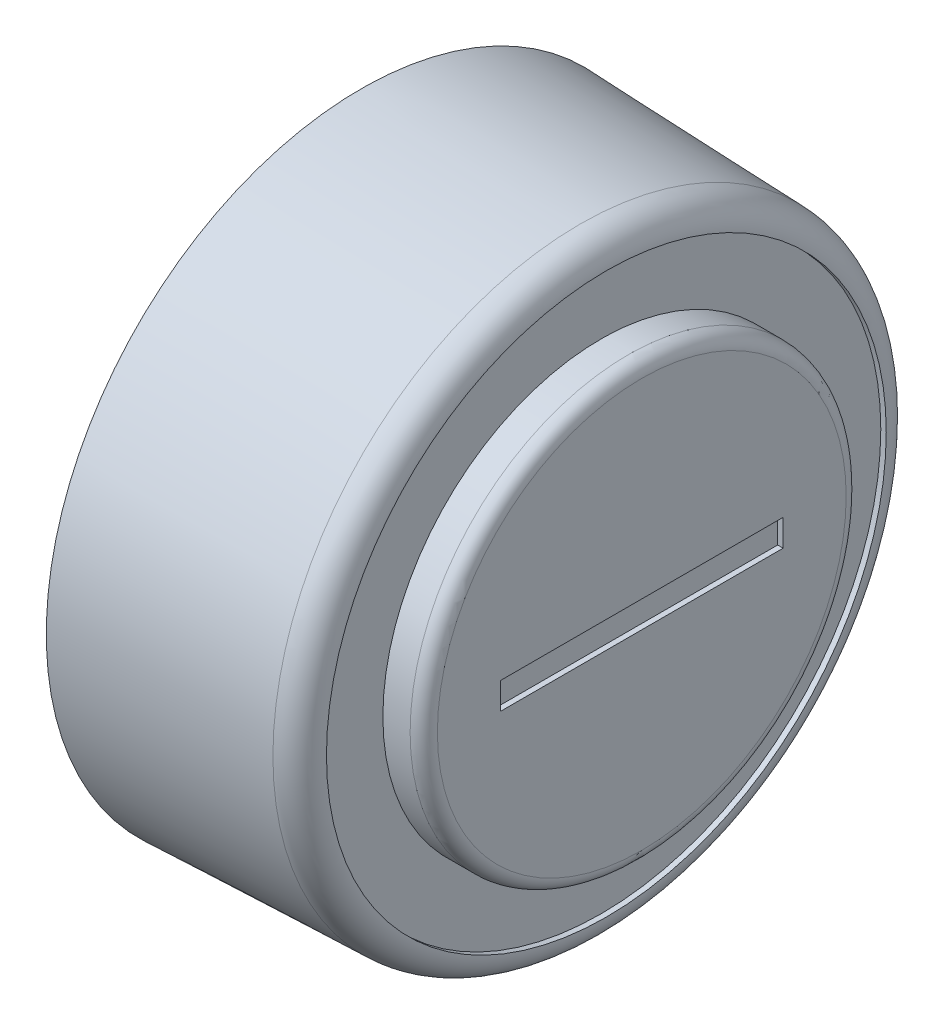
ISO-10303-21;
HEADER;
FILE_DESCRIPTION(('STEP AP214'),'2;1');
FILE_NAME('part.step','',(''),(''),'','','');
FILE_SCHEMA(('AUTOMOTIVE_DESIGN { 1 0 10303 214 1 1 1 1 }'));
ENDSEC;
DATA;
#1=APPLICATION_CONTEXT('core data for automotive mechanical design processes');
#2=APPLICATION_PROTOCOL_DEFINITION('international standard','automotive_design',2000,#1);
#3=PRODUCT_CONTEXT('',#1,'mechanical');
#4=PRODUCT('Part','Part','',(#3));
#5=PRODUCT_RELATED_PRODUCT_CATEGORY('part','',(#4));
#6=PRODUCT_DEFINITION_FORMATION('','',#4);
#7=PRODUCT_DEFINITION_CONTEXT('part definition',#1,'design');
#8=PRODUCT_DEFINITION('design','',#6,#7);
#9=PRODUCT_DEFINITION_SHAPE('','',#8);
#10=(LENGTH_UNIT() NAMED_UNIT(*) SI_UNIT(.MILLI.,.METRE.));
#11=(NAMED_UNIT(*) PLANE_ANGLE_UNIT() SI_UNIT($,.RADIAN.));
#12=(NAMED_UNIT(*) SI_UNIT($,.STERADIAN.) SOLID_ANGLE_UNIT());
#13=UNCERTAINTY_MEASURE_WITH_UNIT(LENGTH_MEASURE(1.E-05),#10,'distance_accuracy_value','');
#14=(GEOMETRIC_REPRESENTATION_CONTEXT(3) GLOBAL_UNCERTAINTY_ASSIGNED_CONTEXT((#13)) GLOBAL_UNIT_ASSIGNED_CONTEXT((#10,
#11,#12)) REPRESENTATION_CONTEXT('',''));
#15=CARTESIAN_POINT('',(0.,0.,0.));
#16=DIRECTION('',(0.,0.,1.));
#17=DIRECTION('',(1.,0.,0.));
#18=AXIS2_PLACEMENT_3D('',#15,#16,#17);
#19=CARTESIAN_POINT('',(5.15,0.,0.));
#20=DIRECTION('',(-1.,0.,0.));
#21=DIRECTION('',(0.,0.,1.));
#22=AXIS2_PLACEMENT_3D('',#19,#20,#21);
#23=CYLINDRICAL_SURFACE('',#22,4.);
#24=CARTESIAN_POINT('',(4.9,0.,0.));
#25=DIRECTION('',(-1.,0.,0.));
#26=DIRECTION('',(0.,0.,1.));
#27=AXIS2_PLACEMENT_3D('',#24,#25,#26);
#28=CIRCLE('',#27,4.);
#29=CARTESIAN_POINT('',(4.9,0.,4.));
#30=VERTEX_POINT('',#29);
#31=EDGE_CURVE('E48',#30,#30,#28,.T.);
#32=CARTESIAN_POINT('',(4.4,0.,0.));
#33=DIRECTION('',(1.,0.,0.));
#34=DIRECTION('',(0.,0.,-1.));
#35=AXIS2_PLACEMENT_3D('',#32,#33,#34);
#36=CIRCLE('',#35,4.);
#37=CARTESIAN_POINT('',(4.4,0.,4.));
#38=VERTEX_POINT('',#37);
#39=EDGE_CURVE('E264',#38,#38,#36,.T.);
#40=CARTESIAN_POINT('',(4.9,0.,4.));
#41=CARTESIAN_POINT('',(4.89479166666667,0.,4.));
#42=CARTESIAN_POINT('',(4.88958333333333,0.,4.));
#43=CARTESIAN_POINT('',(4.87916666666667,0.,4.));
#44=CARTESIAN_POINT('',(4.87395833333333,0.,4.));
#45=CARTESIAN_POINT('',(4.86354166666667,0.,4.));
#46=CARTESIAN_POINT('',(4.85833333333333,0.,4.));
#47=CARTESIAN_POINT('',(4.84791666666667,0.,4.));
#48=CARTESIAN_POINT('',(4.84270833333333,0.,4.));
#49=CARTESIAN_POINT('',(4.83229166666667,0.,4.));
#50=CARTESIAN_POINT('',(4.82708333333333,0.,4.));
#51=CARTESIAN_POINT('',(4.81666666666667,0.,4.));
#52=CARTESIAN_POINT('',(4.81145833333333,0.,4.));
#53=CARTESIAN_POINT('',(4.80104166666667,0.,4.));
#54=CARTESIAN_POINT('',(4.79583333333333,0.,4.));
#55=CARTESIAN_POINT('',(4.78541666666667,0.,4.));
#56=CARTESIAN_POINT('',(4.78020833333333,0.,4.));
#57=CARTESIAN_POINT('',(4.76979166666667,0.,4.));
#58=CARTESIAN_POINT('',(4.76458333333333,0.,4.));
#59=CARTESIAN_POINT('',(4.75416666666667,0.,4.));
#60=CARTESIAN_POINT('',(4.74895833333333,0.,4.));
#61=CARTESIAN_POINT('',(4.73854166666667,0.,4.));
#62=CARTESIAN_POINT('',(4.73333333333333,0.,4.));
#63=CARTESIAN_POINT('',(4.72291666666667,0.,4.));
#64=CARTESIAN_POINT('',(4.71770833333333,0.,4.));
#65=CARTESIAN_POINT('',(4.70729166666667,0.,4.));
#66=CARTESIAN_POINT('',(4.70208333333333,0.,4.));
#67=CARTESIAN_POINT('',(4.69166666666667,0.,4.));
#68=CARTESIAN_POINT('',(4.68645833333333,0.,4.));
#69=CARTESIAN_POINT('',(4.67604166666667,0.,4.));
#70=CARTESIAN_POINT('',(4.67083333333333,0.,4.));
#71=CARTESIAN_POINT('',(4.66041666666667,0.,4.));
#72=CARTESIAN_POINT('',(4.65520833333333,0.,4.));
#73=CARTESIAN_POINT('',(4.64479166666667,0.,4.));
#74=CARTESIAN_POINT('',(4.63958333333333,0.,4.));
#75=CARTESIAN_POINT('',(4.62916666666667,0.,4.));
#76=CARTESIAN_POINT('',(4.62395833333333,0.,4.));
#77=CARTESIAN_POINT('',(4.61354166666667,0.,4.));
#78=CARTESIAN_POINT('',(4.60833333333333,0.,4.));
#79=CARTESIAN_POINT('',(4.59791666666667,0.,4.));
#80=CARTESIAN_POINT('',(4.59270833333333,0.,4.));
#81=CARTESIAN_POINT('',(4.58229166666667,0.,4.));
#82=CARTESIAN_POINT('',(4.57708333333333,0.,4.));
#83=CARTESIAN_POINT('',(4.56666666666667,0.,4.));
#84=CARTESIAN_POINT('',(4.56145833333333,0.,4.));
#85=CARTESIAN_POINT('',(4.55104166666667,0.,4.));
#86=CARTESIAN_POINT('',(4.54583333333333,0.,4.));
#87=CARTESIAN_POINT('',(4.53541666666667,0.,4.));
#88=CARTESIAN_POINT('',(4.53020833333333,0.,4.));
#89=CARTESIAN_POINT('',(4.51979166666667,0.,4.));
#90=CARTESIAN_POINT('',(4.51458333333333,0.,4.));
#91=CARTESIAN_POINT('',(4.50416666666667,0.,4.));
#92=CARTESIAN_POINT('',(4.49895833333333,0.,4.));
#93=CARTESIAN_POINT('',(4.48854166666667,0.,4.));
#94=CARTESIAN_POINT('',(4.48333333333333,0.,4.));
#95=CARTESIAN_POINT('',(4.47291666666667,0.,4.));
#96=CARTESIAN_POINT('',(4.46770833333333,0.,4.));
#97=CARTESIAN_POINT('',(4.45729166666667,0.,4.));
#98=CARTESIAN_POINT('',(4.45208333333333,0.,4.));
#99=CARTESIAN_POINT('',(4.44166666666667,0.,4.));
#100=CARTESIAN_POINT('',(4.43645833333333,0.,4.));
#101=CARTESIAN_POINT('',(4.42604166666666,0.,4.));
#102=CARTESIAN_POINT('',(4.42083333333333,0.,4.));
#103=CARTESIAN_POINT('',(4.41041666666666,0.,4.));
#104=CARTESIAN_POINT('',(4.40520833333333,0.,4.));
#105=CARTESIAN_POINT('',(4.4,0.,4.));
#106=B_SPLINE_CURVE_WITH_KNOTS('',3,(#40,#41,#42,#43,#44,#45,#46,#47,#48,#49,#50,#51,#52,#53,
#54,#55,#56,#57,#58,#59,#60,#61,#62,#63,#64,#65,#66,#67,#68,#69,#70,#71,#72,#73,#74,#75,#76,#77,
#78,#79,#80,#81,#82,#83,#84,#85,#86,#87,#88,#89,#90,#91,#92,#93,#94,#95,#96,#97,#98,#99,#100,
#101,#102,#103,#104,#105),.UNSPECIFIED.,.F.,.F.,(4,2,2,2,2,2,2,2,2,2,2,2,2,2,2,2,2,2,2,2,2,2,2,
2,2,2,2,2,2,2,2,2,4),(0.,0.0156250000000009,0.0312500000000009,0.0468750000000009,
0.0625000000000009,0.0781250000000009,0.0937500000000009,0.109375000000001,0.125000000000001,
0.140625000000001,0.156250000000001,0.171875000000001,0.187500000000001,0.203125000000001,
0.218750000000001,0.234375000000001,0.250000000000001,0.265625000000001,0.281250000000001,
0.296875000000001,0.312500000000001,0.328125000000001,0.343750000000001,0.359375000000001,
0.375000000000001,0.390625000000001,0.406250000000001,0.421875000000001,0.437500000000001,
0.453125000000001,0.468750000000002,0.484375000000002,0.500000000000002),.UNSPECIFIED.);
#107=EDGE_CURVE('BSEAM39',#30,#38,#106,.T.);
#108=ORIENTED_EDGE('',*,*,#31,.T.);
#109=ORIENTED_EDGE('',*,*,#39,.T.);
#110=ORIENTED_EDGE('',*,*,#107,.T.);
#111=ORIENTED_EDGE('',*,*,#107,.F.);
#112=EDGE_LOOP('',(#108,#110,#109,#111));
#113=FACE_BOUND('',#112,.T.);
#114=ADVANCED_FACE('F39',(#113),#23,.T.);
#115=CARTESIAN_POINT('',(5.15,0.,0.));
#116=DIRECTION('',(-1.,0.,0.));
#117=DIRECTION('',(0.,0.,1.));
#118=AXIS2_PLACEMENT_3D('',#115,#116,#117);
#119=PLANE('',#118);
#120=DIRECTION('',(0.,0.,1.));
#121=VECTOR('',#120,1.);
#122=CARTESIAN_POINT('',(5.15,0.244948750695859,2.59357500736811));
#123=LINE('',#122,#121);
#124=CARTESIAN_POINT('',(5.15,0.244948750695859,-2.59357500736811));
#125=VERTEX_POINT('',#124);
#126=CARTESIAN_POINT('',(5.15,0.244948750695859,2.59357500736811));
#127=VERTEX_POINT('',#126);
#128=EDGE_CURVE('E182',#125,#127,#123,.T.);
#129=ORIENTED_EDGE('',*,*,#128,.F.);
#130=DIRECTION('',(0.,1.,0.));
#131=VECTOR('',#130,1.);
#132=CARTESIAN_POINT('',(5.15,0.244948750695859,-2.59357500736811));
#133=LINE('',#132,#131);
#134=CARTESIAN_POINT('',(5.15,-0.244948750695859,-2.59357500736811));
#135=VERTEX_POINT('',#134);
#136=EDGE_CURVE('E55',#135,#125,#133,.T.);
#137=ORIENTED_EDGE('',*,*,#136,.F.);
#138=DIRECTION('',(0.,0.,-1.));
#139=VECTOR('',#138,1.);
#140=CARTESIAN_POINT('',(5.15,-0.244948750695859,2.59357500736811));
#141=LINE('',#140,#139);
#142=CARTESIAN_POINT('',(5.15,-0.244948750695859,2.59357500736811));
#143=VERTEX_POINT('',#142);
#144=EDGE_CURVE('E173',#143,#135,#141,.T.);
#145=ORIENTED_EDGE('',*,*,#144,.F.);
#146=DIRECTION('',(0.,-1.,0.));
#147=VECTOR('',#146,1.);
#148=CARTESIAN_POINT('',(5.15,0.244948750695859,2.59357500736811));
#149=LINE('',#148,#147);
#150=EDGE_CURVE('E176',#127,#143,#149,.T.);
#151=ORIENTED_EDGE('',*,*,#150,.F.);
#152=EDGE_LOOP('',(#129,#137,#145,#151));
#153=FACE_BOUND('',#152,.T.);
#154=CARTESIAN_POINT('',(5.15,0.,0.));
#155=DIRECTION('',(-1.,0.,0.));
#156=DIRECTION('',(0.,0.,1.));
#157=AXIS2_PLACEMENT_3D('',#154,#155,#156);
#158=CIRCLE('',#157,3.75);
#159=CARTESIAN_POINT('',(5.15,0.,3.75));
#160=VERTEX_POINT('',#159);
#161=EDGE_CURVE('E11',#160,#160,#158,.F.);
#162=ORIENTED_EDGE('',*,*,#161,.T.);
#163=EDGE_LOOP('',(#162));
#164=FACE_BOUND('',#163,.T.);
#165=ADVANCED_FACE('F308',(#153,#164),#119,.F.);
#166=CARTESIAN_POINT('',(4.9,0.,0.));
#167=DIRECTION('',(-1.,0.,0.));
#168=DIRECTION('',(0.,0.,1.));
#169=AXIS2_PLACEMENT_3D('',#166,#167,#168);
#170=TOROIDAL_SURFACE('',#169,3.75,0.25);
#171=ORIENTED_EDGE('',*,*,#161,.F.);
#172=EDGE_LOOP('',(#171));
#173=FACE_BOUND('',#172,.T.);
#174=ORIENTED_EDGE('',*,*,#31,.F.);
#175=EDGE_LOOP('',(#174));
#176=FACE_BOUND('',#175,.T.);
#177=ADVANCED_FACE('F41',(#173,#176),#170,.T.);
#178=CARTESIAN_POINT('',(4.4,0.,0.));
#179=DIRECTION('',(1.,0.,0.));
#180=DIRECTION('',(0.,0.,-1.));
#181=AXIS2_PLACEMENT_3D('',#178,#179,#180);
#182=CYLINDRICAL_SURFACE('',#181,5.1350121498836);
#183=CARTESIAN_POINT('',(4.4,0.,0.));
#184=DIRECTION('',(1.,0.,0.));
#185=DIRECTION('',(0.,0.,-1.));
#186=AXIS2_PLACEMENT_3D('',#183,#184,#185);
#187=CIRCLE('',#186,5.1350121498836);
#188=CARTESIAN_POINT('',(4.4,0.,-5.1350121498836));
#189=VERTEX_POINT('',#188);
#190=EDGE_CURVE('E290',#189,#189,#187,.T.);
#191=ORIENTED_EDGE('',*,*,#190,.F.);
#192=EDGE_LOOP('',(#191));
#193=FACE_BOUND('',#192,.T.);
#194=CARTESIAN_POINT('',(4.5,0.,0.));
#195=DIRECTION('',(1.,0.,0.));
#196=DIRECTION('',(0.,0.,-1.));
#197=AXIS2_PLACEMENT_3D('',#194,#195,#196);
#198=CIRCLE('',#197,5.1350121498836);
#199=CARTESIAN_POINT('',(4.5,0.,-5.1350121498836));
#200=VERTEX_POINT('',#199);
#201=EDGE_CURVE('E289',#200,#200,#198,.T.);
#202=ORIENTED_EDGE('',*,*,#201,.T.);
#203=EDGE_LOOP('',(#202));
#204=FACE_BOUND('',#203,.T.);
#205=ADVANCED_FACE('F307',(#193,#204),#182,.F.);
#206=CARTESIAN_POINT('',(4.4,0.,0.));
#207=DIRECTION('',(1.,0.,0.));
#208=DIRECTION('',(0.,0.,-1.));
#209=AXIS2_PLACEMENT_3D('',#206,#207,#208);
#210=PLANE('',#209);
#211=ORIENTED_EDGE('',*,*,#39,.F.);
#212=EDGE_LOOP('',(#211));
#213=FACE_BOUND('',#212,.T.);
#214=ORIENTED_EDGE('',*,*,#190,.T.);
#215=EDGE_LOOP('',(#214));
#216=FACE_BOUND('',#215,.T.);
#217=ADVANCED_FACE('F314',(#213,#216),#210,.T.);
#218=CARTESIAN_POINT('',(0.,0.,0.));
#219=DIRECTION('',(1.,0.,0.));
#220=DIRECTION('',(0.,0.,-1.));
#221=AXIS2_PLACEMENT_3D('',#218,#219,#220);
#222=PLANE('',#221);
#223=DIRECTION('',(0.,0.,-1.));
#224=VECTOR('',#223,1.);
#225=CARTESIAN_POINT('',(0.,2.53594000720439,-0.273766250777746));
#226=LINE('',#225,#224);
#227=CARTESIAN_POINT('',(0.,2.53594000720439,0.273766250777746));
#228=VERTEX_POINT('',#227);
#229=CARTESIAN_POINT('',(0.,2.53594000720439,-0.273766250777746));
#230=VERTEX_POINT('',#229);
#231=EDGE_CURVE('E230',#228,#230,#226,.T.);
#232=ORIENTED_EDGE('',*,*,#231,.F.);
#233=DIRECTION('',(0.,1.,0.));
#234=VECTOR('',#233,1.);
#235=CARTESIAN_POINT('',(0.,0.28084685786711,0.273766250777746));
#236=LINE('',#235,#234);
#237=CARTESIAN_POINT('',(0.,0.28084685786711,0.273766250777746));
#238=VERTEX_POINT('',#237);
#239=EDGE_CURVE('E63',#238,#228,#236,.T.);
#240=ORIENTED_EDGE('',*,*,#239,.F.);
#241=DIRECTION('',(0.,0.,-1.));
#242=VECTOR('',#241,1.);
#243=CARTESIAN_POINT('',(0.,0.28084685786711,0.273766250777746));
#244=LINE('',#243,#242);
#245=CARTESIAN_POINT('',(0.,0.28084685786711,2.45687541707239));
#246=VERTEX_POINT('',#245);
#247=EDGE_CURVE('E195',#246,#238,#244,.T.);
#248=ORIENTED_EDGE('',*,*,#247,.F.);
#249=DIRECTION('',(0.,1.,0.));
#250=VECTOR('',#249,1.);
#251=CARTESIAN_POINT('',(0.,0.28084685786711,2.45687541707239));
#252=LINE('',#251,#250);
#253=CARTESIAN_POINT('',(0.,-0.28084685786711,2.45687541707239));
#254=VERTEX_POINT('',#253);
#255=EDGE_CURVE('E257',#254,#246,#252,.T.);
#256=ORIENTED_EDGE('',*,*,#255,.F.);
#257=DIRECTION('',(0.,0.,1.));
#258=VECTOR('',#257,1.);
#259=CARTESIAN_POINT('',(0.,-0.280846857867111,0.273766250777746));
#260=LINE('',#259,#258);
#261=CARTESIAN_POINT('',(0.,-0.280846857867111,0.273766250777746));
#262=VERTEX_POINT('',#261);
#263=EDGE_CURVE('E254',#262,#254,#260,.T.);
#264=ORIENTED_EDGE('',*,*,#263,.F.);
#265=DIRECTION('',(0.,1.,0.));
#266=VECTOR('',#265,1.);
#267=CARTESIAN_POINT('',(0.,-2.53594000720439,0.273766250777746));
#268=LINE('',#267,#266);
#269=CARTESIAN_POINT('',(0.,-2.53594000720439,0.273766250777746));
#270=VERTEX_POINT('',#269);
#271=EDGE_CURVE('E251',#270,#262,#268,.T.);
#272=ORIENTED_EDGE('',*,*,#271,.F.);
#273=DIRECTION('',(0.,0.,1.));
#274=VECTOR('',#273,1.);
#275=CARTESIAN_POINT('',(0.,-2.53594000720439,-0.273766250777746));
#276=LINE('',#275,#274);
#277=CARTESIAN_POINT('',(0.,-2.53594000720439,-0.273766250777746));
#278=VERTEX_POINT('',#277);
#279=EDGE_CURVE('E248',#278,#270,#276,.T.);
#280=ORIENTED_EDGE('',*,*,#279,.F.);
#281=DIRECTION('',(0.,-1.,0.));
#282=VECTOR('',#281,1.);
#283=CARTESIAN_POINT('',(0.,-2.53594000720439,-0.273766250777746));
#284=LINE('',#283,#282);
#285=CARTESIAN_POINT('',(0.,-0.280846857867111,-0.273766250777746));
#286=VERTEX_POINT('',#285);
#287=EDGE_CURVE('E245',#286,#278,#284,.T.);
#288=ORIENTED_EDGE('',*,*,#287,.F.);
#289=DIRECTION('',(0.,0.,1.));
#290=VECTOR('',#289,1.);
#291=CARTESIAN_POINT('',(0.,-0.28084685786711,-2.45687541707239));
#292=LINE('',#291,#290);
#293=CARTESIAN_POINT('',(0.,-0.28084685786711,-2.45687541707239));
#294=VERTEX_POINT('',#293);
#295=EDGE_CURVE('E242',#294,#286,#292,.T.);
#296=ORIENTED_EDGE('',*,*,#295,.F.);
#297=DIRECTION('',(0.,-1.,0.));
#298=VECTOR('',#297,1.);
#299=CARTESIAN_POINT('',(0.,0.28084685786711,-2.45687541707239));
#300=LINE('',#299,#298);
#301=CARTESIAN_POINT('',(0.,0.28084685786711,-2.45687541707239));
#302=VERTEX_POINT('',#301);
#303=EDGE_CURVE('E239',#302,#294,#300,.T.);
#304=ORIENTED_EDGE('',*,*,#303,.F.);
#305=DIRECTION('',(0.,0.,-1.));
#306=VECTOR('',#305,1.);
#307=CARTESIAN_POINT('',(0.,0.28084685786711,-2.45687541707239));
#308=LINE('',#307,#306);
#309=CARTESIAN_POINT('',(0.,0.280846857867111,-0.273766250777746));
#310=VERTEX_POINT('',#309);
#311=EDGE_CURVE('E236',#310,#302,#308,.T.);
#312=ORIENTED_EDGE('',*,*,#311,.F.);
#313=DIRECTION('',(0.,-1.,0.));
#314=VECTOR('',#313,1.);
#315=CARTESIAN_POINT('',(0.,0.280846857867111,-0.273766250777746));
#316=LINE('',#315,#314);
#317=EDGE_CURVE('E233',#230,#310,#316,.T.);
#318=ORIENTED_EDGE('',*,*,#317,.F.);
#319=EDGE_LOOP('',(#232,#240,#248,#256,#264,#272,#280,#288,#296,#304,#312,#318));
#320=FACE_BOUND('',#319,.T.);
#321=CARTESIAN_POINT('',(0.,0.,0.));
#322=DIRECTION('',(1.,0.,0.));
#323=DIRECTION('',(0.,0.,-1.));
#324=AXIS2_PLACEMENT_3D('',#321,#322,#323);
#325=CIRCLE('',#324,5.775);
#326=CARTESIAN_POINT('',(0.,0.,-5.775));
#327=VERTEX_POINT('',#326);
#328=EDGE_CURVE('E293',#327,#327,#325,.T.);
#329=ORIENTED_EDGE('',*,*,#328,.F.);
#330=EDGE_LOOP('',(#329));
#331=FACE_BOUND('',#330,.T.);
#332=ADVANCED_FACE('F326',(#320,#331),#222,.F.);
#333=CARTESIAN_POINT('',(0.,0.,0.));
#334=DIRECTION('',(-1.,0.,0.));
#335=DIRECTION('',(0.,0.,-1.));
#336=AXIS2_PLACEMENT_3D('',#333,#334,#335);
#337=CONICAL_SURFACE('',#336,5.775,0.0349065850398867);
#338=CARTESIAN_POINT('',(4.01744974835125,0.,0.));
#339=DIRECTION('',(-1.,0.,0.));
#340=DIRECTION('',(0.,0.,1.));
#341=AXIS2_PLACEMENT_3D('',#338,#339,#340);
#342=CIRCLE('',#341,5.63470756339315);
#343=CARTESIAN_POINT('',(4.01744974835125,0.,5.63470756339315));
#344=VERTEX_POINT('',#343);
#345=EDGE_CURVE('E298',#344,#344,#342,.T.);
#346=ORIENTED_EDGE('',*,*,#345,.T.);
#347=EDGE_LOOP('',(#346));
#348=FACE_BOUND('',#347,.T.);
#349=ORIENTED_EDGE('',*,*,#328,.T.);
#350=EDGE_LOOP('',(#349));
#351=FACE_BOUND('',#350,.T.);
#352=ADVANCED_FACE('F329',(#348,#351),#337,.T.);
#353=CARTESIAN_POINT('',(4.,0.,0.));
#354=DIRECTION('',(1.,0.,0.));
#355=DIRECTION('',(0.,0.,-1.));
#356=AXIS2_PLACEMENT_3D('',#353,#354,#355);
#357=TOROIDAL_SURFACE('',#356,5.1350121498836,0.5);
#358=ORIENTED_EDGE('',*,*,#345,.F.);
#359=EDGE_LOOP('',(#358));
#360=FACE_BOUND('',#359,.T.);
#361=ORIENTED_EDGE('',*,*,#201,.F.);
#362=EDGE_LOOP('',(#361));
#363=FACE_BOUND('',#362,.T.);
#364=ADVANCED_FACE('F332',(#360,#363),#357,.T.);
#365=CARTESIAN_POINT('',(0.1,0.28084685786711,0.273766250777746));
#366=DIRECTION('',(0.,0.,1.));
#367=DIRECTION('',(1.,0.,0.));
#368=AXIS2_PLACEMENT_3D('',#365,#366,#367);
#369=PLANE('',#368);
#370=ORIENTED_EDGE('',*,*,#239,.T.);
#371=DIRECTION('',(-1.,0.,0.));
#372=VECTOR('',#371,1.);
#373=CARTESIAN_POINT('',(0.1,2.53594000720439,0.273766250777746));
#374=LINE('',#373,#372);
#375=CARTESIAN_POINT('',(0.1,2.53594000720439,0.273766250777746));
#376=VERTEX_POINT('',#375);
#377=EDGE_CURVE('E228',#376,#228,#374,.T.);
#378=ORIENTED_EDGE('',*,*,#377,.F.);
#379=DIRECTION('',(0.,1.,0.));
#380=VECTOR('',#379,1.);
#381=CARTESIAN_POINT('',(0.1,0.28084685786711,0.273766250777746));
#382=LINE('',#381,#380);
#383=CARTESIAN_POINT('',(0.1,0.28084685786711,0.273766250777746));
#384=VERTEX_POINT('',#383);
#385=EDGE_CURVE('E191',#384,#376,#382,.T.);
#386=ORIENTED_EDGE('',*,*,#385,.F.);
#387=DIRECTION('',(-1.,0.,0.));
#388=VECTOR('',#387,1.);
#389=CARTESIAN_POINT('',(0.1,0.28084685786711,0.273766250777746));
#390=LINE('',#389,#388);
#391=EDGE_CURVE('E262',#384,#238,#390,.T.);
#392=ORIENTED_EDGE('',*,*,#391,.T.);
#393=EDGE_LOOP('',(#370,#378,#386,#392));
#394=FACE_BOUND('',#393,.T.);
#395=ADVANCED_FACE('F335',(#394),#369,.F.);
#396=CARTESIAN_POINT('',(0.1,0.28084685786711,0.273766250777746));
#397=DIRECTION('',(0.,1.,0.));
#398=DIRECTION('',(0.,0.,1.));
#399=AXIS2_PLACEMENT_3D('',#396,#397,#398);
#400=PLANE('',#399);
#401=ORIENTED_EDGE('',*,*,#247,.T.);
#402=ORIENTED_EDGE('',*,*,#391,.F.);
#403=DIRECTION('',(0.,0.,-1.));
#404=VECTOR('',#403,1.);
#405=CARTESIAN_POINT('',(0.1,0.28084685786711,0.273766250777746));
#406=LINE('',#405,#404);
#407=CARTESIAN_POINT('',(0.1,0.28084685786711,2.45687541707239));
#408=VERTEX_POINT('',#407);
#409=EDGE_CURVE('E225',#408,#384,#406,.T.);
#410=ORIENTED_EDGE('',*,*,#409,.F.);
#411=DIRECTION('',(-1.,0.,0.));
#412=VECTOR('',#411,1.);
#413=CARTESIAN_POINT('',(0.1,0.28084685786711,2.45687541707239));
#414=LINE('',#413,#412);
#415=EDGE_CURVE('E265',#408,#246,#414,.T.);
#416=ORIENTED_EDGE('',*,*,#415,.T.);
#417=EDGE_LOOP('',(#401,#402,#410,#416));
#418=FACE_BOUND('',#417,.T.);
#419=ADVANCED_FACE('F340',(#418),#400,.F.);
#420=CARTESIAN_POINT('',(0.1,0.28084685786711,2.45687541707239));
#421=DIRECTION('',(0.,0.,1.));
#422=DIRECTION('',(1.,0.,0.));
#423=AXIS2_PLACEMENT_3D('',#420,#421,#422);
#424=PLANE('',#423);
#425=ORIENTED_EDGE('',*,*,#255,.T.);
#426=ORIENTED_EDGE('',*,*,#415,.F.);
#427=DIRECTION('',(0.,1.,0.));
#428=VECTOR('',#427,1.);
#429=CARTESIAN_POINT('',(0.1,0.28084685786711,2.45687541707239));
#430=LINE('',#429,#428);
#431=CARTESIAN_POINT('',(0.1,-0.28084685786711,2.45687541707239));
#432=VERTEX_POINT('',#431);
#433=EDGE_CURVE('E222',#432,#408,#430,.T.);
#434=ORIENTED_EDGE('',*,*,#433,.F.);
#435=DIRECTION('',(-1.,0.,0.));
#436=VECTOR('',#435,1.);
#437=CARTESIAN_POINT('',(0.1,-0.28084685786711,2.45687541707239));
#438=LINE('',#437,#436);
#439=EDGE_CURVE('E267',#432,#254,#438,.T.);
#440=ORIENTED_EDGE('',*,*,#439,.T.);
#441=EDGE_LOOP('',(#425,#426,#434,#440));
#442=FACE_BOUND('',#441,.T.);
#443=ADVANCED_FACE('F352',(#442),#424,.F.);
#444=CARTESIAN_POINT('',(0.1,-0.280846857867111,0.273766250777746));
#445=DIRECTION('',(0.,-1.,0.));
#446=DIRECTION('',(0.,0.,-1.));
#447=AXIS2_PLACEMENT_3D('',#444,#445,#446);
#448=PLANE('',#447);
#449=ORIENTED_EDGE('',*,*,#263,.T.);
#450=ORIENTED_EDGE('',*,*,#439,.F.);
#451=DIRECTION('',(0.,0.,1.));
#452=VECTOR('',#451,1.);
#453=CARTESIAN_POINT('',(0.1,-0.280846857867111,0.273766250777746));
#454=LINE('',#453,#452);
#455=CARTESIAN_POINT('',(0.1,-0.280846857867111,0.273766250777746));
#456=VERTEX_POINT('',#455);
#457=EDGE_CURVE('E219',#456,#432,#454,.T.);
#458=ORIENTED_EDGE('',*,*,#457,.F.);
#459=DIRECTION('',(-1.,0.,0.));
#460=VECTOR('',#459,1.);
#461=CARTESIAN_POINT('',(0.1,-0.280846857867111,0.273766250777746));
#462=LINE('',#461,#460);
#463=EDGE_CURVE('E269',#456,#262,#462,.T.);
#464=ORIENTED_EDGE('',*,*,#463,.T.);
#465=EDGE_LOOP('',(#449,#450,#458,#464));
#466=FACE_BOUND('',#465,.T.);
#467=ADVANCED_FACE('F445',(#466),#448,.F.);
#468=CARTESIAN_POINT('',(0.1,-2.53594000720439,0.273766250777746));
#469=DIRECTION('',(0.,0.,1.));
#470=DIRECTION('',(0.,-1.,0.));
#471=AXIS2_PLACEMENT_3D('',#468,#469,#470);
#472=PLANE('',#471);
#473=ORIENTED_EDGE('',*,*,#271,.T.);
#474=ORIENTED_EDGE('',*,*,#463,.F.);
#475=DIRECTION('',(0.,1.,0.));
#476=VECTOR('',#475,1.);
#477=CARTESIAN_POINT('',(0.1,-2.53594000720439,0.273766250777746));
#478=LINE('',#477,#476);
#479=CARTESIAN_POINT('',(0.1,-2.53594000720439,0.273766250777746));
#480=VERTEX_POINT('',#479);
#481=EDGE_CURVE('E216',#480,#456,#478,.T.);
#482=ORIENTED_EDGE('',*,*,#481,.F.);
#483=DIRECTION('',(-1.,0.,0.));
#484=VECTOR('',#483,1.);
#485=CARTESIAN_POINT('',(0.1,-2.53594000720439,0.273766250777746));
#486=LINE('',#485,#484);
#487=EDGE_CURVE('E271',#480,#270,#486,.T.);
#488=ORIENTED_EDGE('',*,*,#487,.T.);
#489=EDGE_LOOP('',(#473,#474,#482,#488));
#490=FACE_BOUND('',#489,.T.);
#491=ADVANCED_FACE('F455',(#490),#472,.F.);
#492=CARTESIAN_POINT('',(0.1,-2.53594000720439,-0.273766250777746));
#493=DIRECTION('',(0.,-1.,0.));
#494=DIRECTION('',(0.,0.,-1.));
#495=AXIS2_PLACEMENT_3D('',#492,#493,#494);
#496=PLANE('',#495);
#497=ORIENTED_EDGE('',*,*,#279,.T.);
#498=ORIENTED_EDGE('',*,*,#487,.F.);
#499=DIRECTION('',(0.,0.,1.));
#500=VECTOR('',#499,1.);
#501=CARTESIAN_POINT('',(0.1,-2.53594000720439,-0.273766250777746));
#502=LINE('',#501,#500);
#503=CARTESIAN_POINT('',(0.1,-2.53594000720439,-0.273766250777746));
#504=VERTEX_POINT('',#503);
#505=EDGE_CURVE('E213',#504,#480,#502,.T.);
#506=ORIENTED_EDGE('',*,*,#505,.F.);
#507=DIRECTION('',(-1.,0.,0.));
#508=VECTOR('',#507,1.);
#509=CARTESIAN_POINT('',(0.1,-2.53594000720439,-0.273766250777746));
#510=LINE('',#509,#508);
#511=EDGE_CURVE('E273',#504,#278,#510,.T.);
#512=ORIENTED_EDGE('',*,*,#511,.T.);
#513=EDGE_LOOP('',(#497,#498,#506,#512));
#514=FACE_BOUND('',#513,.T.);
#515=ADVANCED_FACE('F465',(#514),#496,.F.);
#516=CARTESIAN_POINT('',(0.1,-2.53594000720439,-0.273766250777746));
#517=DIRECTION('',(0.,0.,-1.));
#518=DIRECTION('',(-1.,0.,0.));
#519=AXIS2_PLACEMENT_3D('',#516,#517,#518);
#520=PLANE('',#519);
#521=ORIENTED_EDGE('',*,*,#287,.T.);
#522=ORIENTED_EDGE('',*,*,#511,.F.);
#523=DIRECTION('',(0.,-1.,0.));
#524=VECTOR('',#523,1.);
#525=CARTESIAN_POINT('',(0.1,-2.53594000720439,-0.273766250777746));
#526=LINE('',#525,#524);
#527=CARTESIAN_POINT('',(0.1,-0.280846857867111,-0.273766250777746));
#528=VERTEX_POINT('',#527);
#529=EDGE_CURVE('E210',#528,#504,#526,.T.);
#530=ORIENTED_EDGE('',*,*,#529,.F.);
#531=DIRECTION('',(-1.,0.,0.));
#532=VECTOR('',#531,1.);
#533=CARTESIAN_POINT('',(0.1,-0.280846857867111,-0.273766250777746));
#534=LINE('',#533,#532);
#535=EDGE_CURVE('E275',#528,#286,#534,.T.);
#536=ORIENTED_EDGE('',*,*,#535,.T.);
#537=EDGE_LOOP('',(#521,#522,#530,#536));
#538=FACE_BOUND('',#537,.T.);
#539=ADVANCED_FACE('F475',(#538),#520,.F.);
#540=CARTESIAN_POINT('',(0.1,-0.28084685786711,-2.45687541707239));
#541=DIRECTION('',(0.,-1.,0.));
#542=DIRECTION('',(0.,0.,-1.));
#543=AXIS2_PLACEMENT_3D('',#540,#541,#542);
#544=PLANE('',#543);
#545=ORIENTED_EDGE('',*,*,#295,.T.);
#546=ORIENTED_EDGE('',*,*,#535,.F.);
#547=DIRECTION('',(0.,0.,1.));
#548=VECTOR('',#547,1.);
#549=CARTESIAN_POINT('',(0.1,-0.28084685786711,-2.45687541707239));
#550=LINE('',#549,#548);
#551=CARTESIAN_POINT('',(0.1,-0.28084685786711,-2.45687541707239));
#552=VERTEX_POINT('',#551);
#553=EDGE_CURVE('E207',#552,#528,#550,.T.);
#554=ORIENTED_EDGE('',*,*,#553,.F.);
#555=DIRECTION('',(-1.,0.,0.));
#556=VECTOR('',#555,1.);
#557=CARTESIAN_POINT('',(0.1,-0.28084685786711,-2.45687541707239));
#558=LINE('',#557,#556);
#559=EDGE_CURVE('E277',#552,#294,#558,.T.);
#560=ORIENTED_EDGE('',*,*,#559,.T.);
#561=EDGE_LOOP('',(#545,#546,#554,#560));
#562=FACE_BOUND('',#561,.T.);
#563=ADVANCED_FACE('F485',(#562),#544,.F.);
#564=CARTESIAN_POINT('',(0.1,0.28084685786711,-2.45687541707239));
#565=DIRECTION('',(0.,0.,-1.));
#566=DIRECTION('',(-1.,0.,0.));
#567=AXIS2_PLACEMENT_3D('',#564,#565,#566);
#568=PLANE('',#567);
#569=ORIENTED_EDGE('',*,*,#303,.T.);
#570=ORIENTED_EDGE('',*,*,#559,.F.);
#571=DIRECTION('',(0.,-1.,0.));
#572=VECTOR('',#571,1.);
#573=CARTESIAN_POINT('',(0.1,0.28084685786711,-2.45687541707239));
#574=LINE('',#573,#572);
#575=CARTESIAN_POINT('',(0.1,0.28084685786711,-2.45687541707239));
#576=VERTEX_POINT('',#575);
#577=EDGE_CURVE('E204',#576,#552,#574,.T.);
#578=ORIENTED_EDGE('',*,*,#577,.F.);
#579=DIRECTION('',(-1.,0.,0.));
#580=VECTOR('',#579,1.);
#581=CARTESIAN_POINT('',(0.1,0.28084685786711,-2.45687541707239));
#582=LINE('',#581,#580);
#583=EDGE_CURVE('E279',#576,#302,#582,.T.);
#584=ORIENTED_EDGE('',*,*,#583,.T.);
#585=EDGE_LOOP('',(#569,#570,#578,#584));
#586=FACE_BOUND('',#585,.T.);
#587=ADVANCED_FACE('F495',(#586),#568,.F.);
#588=CARTESIAN_POINT('',(0.1,0.28084685786711,-2.45687541707239));
#589=DIRECTION('',(0.,1.,0.));
#590=DIRECTION('',(0.,0.,1.));
#591=AXIS2_PLACEMENT_3D('',#588,#589,#590);
#592=PLANE('',#591);
#593=ORIENTED_EDGE('',*,*,#311,.T.);
#594=ORIENTED_EDGE('',*,*,#583,.F.);
#595=DIRECTION('',(0.,0.,-1.));
#596=VECTOR('',#595,1.);
#597=CARTESIAN_POINT('',(0.1,0.28084685786711,-2.45687541707239));
#598=LINE('',#597,#596);
#599=CARTESIAN_POINT('',(0.1,0.280846857867111,-0.273766250777746));
#600=VERTEX_POINT('',#599);
#601=EDGE_CURVE('E201',#600,#576,#598,.T.);
#602=ORIENTED_EDGE('',*,*,#601,.F.);
#603=DIRECTION('',(-1.,0.,0.));
#604=VECTOR('',#603,1.);
#605=CARTESIAN_POINT('',(0.1,0.280846857867111,-0.273766250777746));
#606=LINE('',#605,#604);
#607=EDGE_CURVE('E281',#600,#310,#606,.T.);
#608=ORIENTED_EDGE('',*,*,#607,.T.);
#609=EDGE_LOOP('',(#593,#594,#602,#608));
#610=FACE_BOUND('',#609,.T.);
#611=ADVANCED_FACE('F505',(#610),#592,.F.);
#612=CARTESIAN_POINT('',(0.1,0.280846857867111,-0.273766250777746));
#613=DIRECTION('',(0.,0.,-1.));
#614=DIRECTION('',(-1.,0.,0.));
#615=AXIS2_PLACEMENT_3D('',#612,#613,#614);
#616=PLANE('',#615);
#617=ORIENTED_EDGE('',*,*,#317,.T.);
#618=ORIENTED_EDGE('',*,*,#607,.F.);
#619=DIRECTION('',(0.,-1.,0.));
#620=VECTOR('',#619,1.);
#621=CARTESIAN_POINT('',(0.1,0.280846857867111,-0.273766250777746));
#622=LINE('',#621,#620);
#623=CARTESIAN_POINT('',(0.1,2.53594000720439,-0.273766250777746));
#624=VERTEX_POINT('',#623);
#625=EDGE_CURVE('E198',#624,#600,#622,.T.);
#626=ORIENTED_EDGE('',*,*,#625,.F.);
#627=DIRECTION('',(-1.,0.,0.));
#628=VECTOR('',#627,1.);
#629=CARTESIAN_POINT('',(0.1,2.53594000720439,-0.273766250777746));
#630=LINE('',#629,#628);
#631=EDGE_CURVE('E283',#624,#230,#630,.T.);
#632=ORIENTED_EDGE('',*,*,#631,.T.);
#633=EDGE_LOOP('',(#617,#618,#626,#632));
#634=FACE_BOUND('',#633,.T.);
#635=ADVANCED_FACE('F515',(#634),#616,.F.);
#636=CARTESIAN_POINT('',(0.1,2.53594000720439,-0.273766250777746));
#637=DIRECTION('',(0.,1.,0.));
#638=DIRECTION('',(0.,0.,1.));
#639=AXIS2_PLACEMENT_3D('',#636,#637,#638);
#640=PLANE('',#639);
#641=ORIENTED_EDGE('',*,*,#231,.T.);
#642=ORIENTED_EDGE('',*,*,#631,.F.);
#643=DIRECTION('',(0.,0.,-1.));
#644=VECTOR('',#643,1.);
#645=CARTESIAN_POINT('',(0.1,2.53594000720439,-0.273766250777746));
#646=LINE('',#645,#644);
#647=EDGE_CURVE('E194',#376,#624,#646,.T.);
#648=ORIENTED_EDGE('',*,*,#647,.F.);
#649=ORIENTED_EDGE('',*,*,#377,.T.);
#650=EDGE_LOOP('',(#641,#642,#648,#649));
#651=FACE_BOUND('',#650,.T.);
#652=ADVANCED_FACE('F357',(#651),#640,.F.);
#653=CARTESIAN_POINT('',(0.1,0.,0.));
#654=DIRECTION('',(1.,0.,0.));
#655=DIRECTION('',(0.,0.,-1.));
#656=AXIS2_PLACEMENT_3D('',#653,#654,#655);
#657=PLANE('',#656);
#658=ORIENTED_EDGE('',*,*,#385,.T.);
#659=ORIENTED_EDGE('',*,*,#647,.T.);
#660=ORIENTED_EDGE('',*,*,#625,.T.);
#661=ORIENTED_EDGE('',*,*,#601,.T.);
#662=ORIENTED_EDGE('',*,*,#577,.T.);
#663=ORIENTED_EDGE('',*,*,#553,.T.);
#664=ORIENTED_EDGE('',*,*,#529,.T.);
#665=ORIENTED_EDGE('',*,*,#505,.T.);
#666=ORIENTED_EDGE('',*,*,#481,.T.);
#667=ORIENTED_EDGE('',*,*,#457,.T.);
#668=ORIENTED_EDGE('',*,*,#433,.T.);
#669=ORIENTED_EDGE('',*,*,#409,.T.);
#670=EDGE_LOOP('',(#658,#659,#660,#661,#662,#663,#664,#665,#666,#667,#668,#669));
#671=FACE_BOUND('',#670,.T.);
#672=ADVANCED_FACE('F370',(#671),#657,.F.);
#673=CARTESIAN_POINT('',(5.05,0.244948750695859,-2.59357500736811));
#674=DIRECTION('',(0.,0.,-1.));
#675=DIRECTION('',(-1.,0.,0.));
#676=AXIS2_PLACEMENT_3D('',#673,#674,#675);
#677=PLANE('',#676);
#678=ORIENTED_EDGE('',*,*,#136,.T.);
#679=DIRECTION('',(1.,0.,0.));
#680=VECTOR('',#679,1.);
#681=CARTESIAN_POINT('',(5.05,0.244948750695859,-2.59357500736811));
#682=LINE('',#681,#680);
#683=CARTESIAN_POINT('',(5.05,0.244948750695859,-2.59357500736811));
#684=VERTEX_POINT('',#683);
#685=EDGE_CURVE('E151',#684,#125,#682,.T.);
#686=ORIENTED_EDGE('',*,*,#685,.F.);
#687=DIRECTION('',(0.,1.,0.));
#688=VECTOR('',#687,1.);
#689=CARTESIAN_POINT('',(5.05,0.244948750695859,-2.59357500736811));
#690=LINE('',#689,#688);
#691=CARTESIAN_POINT('',(5.05,-0.244948750695859,-2.59357500736811));
#692=VERTEX_POINT('',#691);
#693=EDGE_CURVE('E155',#692,#684,#690,.T.);
#694=ORIENTED_EDGE('',*,*,#693,.F.);
#695=DIRECTION('',(1.,0.,0.));
#696=VECTOR('',#695,1.);
#697=CARTESIAN_POINT('',(5.05,-0.244948750695859,-2.59357500736811));
#698=LINE('',#697,#696);
#699=EDGE_CURVE('E186',#692,#135,#698,.T.);
#700=ORIENTED_EDGE('',*,*,#699,.T.);
#701=EDGE_LOOP('',(#678,#686,#694,#700));
#702=FACE_BOUND('',#701,.T.);
#703=ADVANCED_FACE('F153',(#702),#677,.F.);
#704=CARTESIAN_POINT('',(5.05,-0.244948750695859,2.59357500736811));
#705=DIRECTION('',(0.,-1.,0.));
#706=DIRECTION('',(0.,0.,-1.));
#707=AXIS2_PLACEMENT_3D('',#704,#705,#706);
#708=PLANE('',#707);
#709=ORIENTED_EDGE('',*,*,#144,.T.);
#710=ORIENTED_EDGE('',*,*,#699,.F.);
#711=DIRECTION('',(0.,0.,-1.));
#712=VECTOR('',#711,1.);
#713=CARTESIAN_POINT('',(5.05,-0.244948750695859,2.59357500736811));
#714=LINE('',#713,#712);
#715=CARTESIAN_POINT('',(5.05,-0.244948750695859,2.59357500736811));
#716=VERTEX_POINT('',#715);
#717=EDGE_CURVE('E161',#716,#692,#714,.T.);
#718=ORIENTED_EDGE('',*,*,#717,.F.);
#719=DIRECTION('',(1.,0.,0.));
#720=VECTOR('',#719,1.);
#721=CARTESIAN_POINT('',(5.05,-0.244948750695859,2.59357500736811));
#722=LINE('',#721,#720);
#723=EDGE_CURVE('E188',#716,#143,#722,.T.);
#724=ORIENTED_EDGE('',*,*,#723,.T.);
#725=EDGE_LOOP('',(#709,#710,#718,#724));
#726=FACE_BOUND('',#725,.T.);
#727=ADVANCED_FACE('F402',(#726),#708,.F.);
#728=CARTESIAN_POINT('',(5.05,0.244948750695859,2.59357500736811));
#729=DIRECTION('',(0.,0.,1.));
#730=DIRECTION('',(1.,0.,0.));
#731=AXIS2_PLACEMENT_3D('',#728,#729,#730);
#732=PLANE('',#731);
#733=ORIENTED_EDGE('',*,*,#150,.T.);
#734=ORIENTED_EDGE('',*,*,#723,.F.);
#735=DIRECTION('',(0.,-1.,0.));
#736=VECTOR('',#735,1.);
#737=CARTESIAN_POINT('',(5.05,0.244948750695859,2.59357500736811));
#738=LINE('',#737,#736);
#739=CARTESIAN_POINT('',(5.05,0.244948750695859,2.59357500736811));
#740=VERTEX_POINT('',#739);
#741=EDGE_CURVE('E169',#740,#716,#738,.T.);
#742=ORIENTED_EDGE('',*,*,#741,.F.);
#743=DIRECTION('',(1.,0.,0.));
#744=VECTOR('',#743,1.);
#745=CARTESIAN_POINT('',(5.05,0.244948750695859,2.59357500736811));
#746=LINE('',#745,#744);
#747=EDGE_CURVE('E160',#740,#127,#746,.T.);
#748=ORIENTED_EDGE('',*,*,#747,.T.);
#749=EDGE_LOOP('',(#733,#734,#742,#748));
#750=FACE_BOUND('',#749,.T.);
#751=ADVANCED_FACE('F395',(#750),#732,.F.);
#752=CARTESIAN_POINT('',(5.05,0.244948750695859,2.59357500736811));
#753=DIRECTION('',(0.,1.,0.));
#754=DIRECTION('',(0.,0.,1.));
#755=AXIS2_PLACEMENT_3D('',#752,#753,#754);
#756=PLANE('',#755);
#757=ORIENTED_EDGE('',*,*,#128,.T.);
#758=ORIENTED_EDGE('',*,*,#747,.F.);
#759=DIRECTION('',(0.,0.,1.));
#760=VECTOR('',#759,1.);
#761=CARTESIAN_POINT('',(5.05,0.244948750695859,2.59357500736811));
#762=LINE('',#761,#760);
#763=EDGE_CURVE('E164',#684,#740,#762,.T.);
#764=ORIENTED_EDGE('',*,*,#763,.F.);
#765=ORIENTED_EDGE('',*,*,#685,.T.);
#766=EDGE_LOOP('',(#757,#758,#764,#765));
#767=FACE_BOUND('',#766,.T.);
#768=ADVANCED_FACE('F165',(#767),#756,.F.);
#769=CARTESIAN_POINT('',(5.05,0.,0.));
#770=DIRECTION('',(1.,0.,0.));
#771=DIRECTION('',(0.,0.,-1.));
#772=AXIS2_PLACEMENT_3D('',#769,#770,#771);
#773=PLANE('',#772);
#774=ORIENTED_EDGE('',*,*,#693,.T.);
#775=ORIENTED_EDGE('',*,*,#763,.T.);
#776=ORIENTED_EDGE('',*,*,#741,.T.);
#777=ORIENTED_EDGE('',*,*,#717,.T.);
#778=EDGE_LOOP('',(#774,#775,#776,#777));
#779=FACE_BOUND('',#778,.T.);
#780=ADVANCED_FACE('F171',(#779),#773,.T.);
#781=CLOSED_SHELL('',(#114,#165,#177,#205,#217,#332,#352,#364,#395,#419,#443,#467,#491,#515,
#539,#563,#587,#611,#635,#652,#672,#703,#727,#751,#768,#780));
#782=MANIFOLD_SOLID_BREP('B2',#781);
#783=ADVANCED_BREP_SHAPE_REPRESENTATION('',(#18,#782),#14);
#784=SHAPE_DEFINITION_REPRESENTATION(#9,#783);
ENDSEC;
END-ISO-10303-21;
